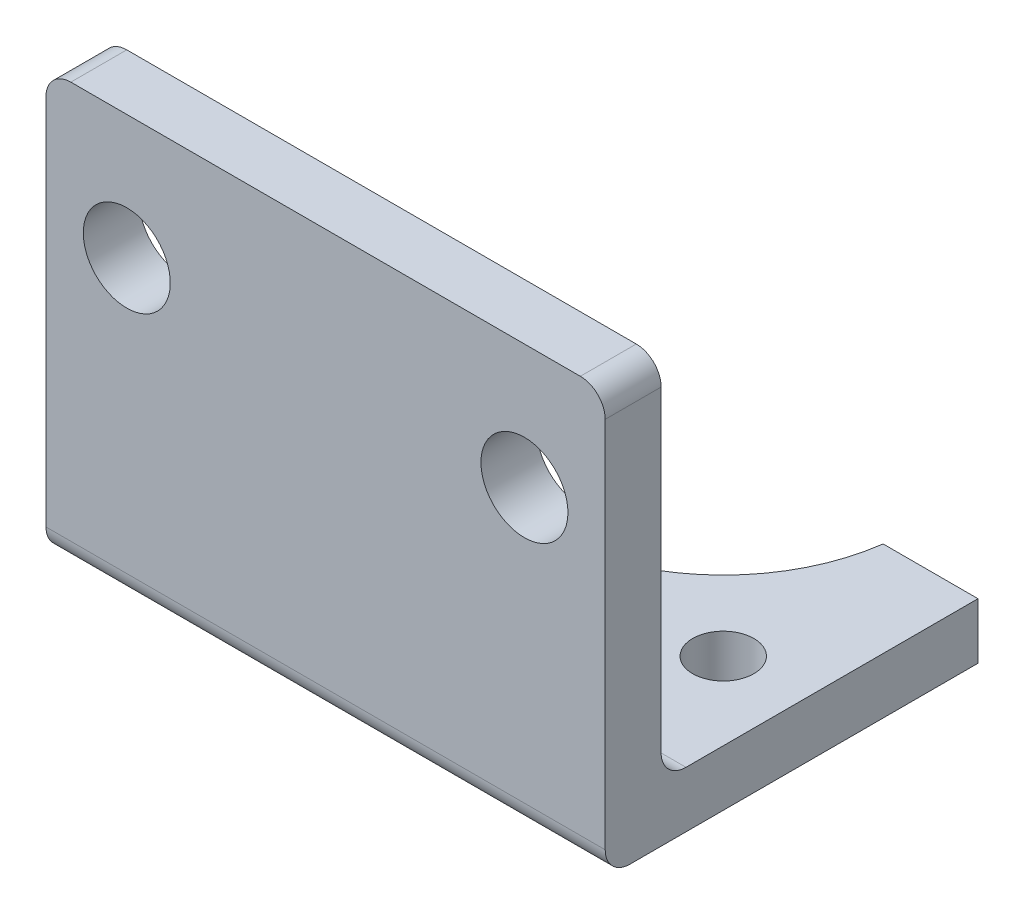
ISO-10303-21;
HEADER;
FILE_DESCRIPTION(('STEP AP214'),'2;1');
FILE_NAME('part.step','',(''),(''),'','','');
FILE_SCHEMA(('AUTOMOTIVE_DESIGN { 1 0 10303 214 1 1 1 1 }'));
ENDSEC;
DATA;
#1=APPLICATION_CONTEXT('core data for automotive mechanical design processes');
#2=APPLICATION_PROTOCOL_DEFINITION('international standard','automotive_design',2000,#1);
#3=PRODUCT_CONTEXT('',#1,'mechanical');
#4=PRODUCT('Part','Part','',(#3));
#5=PRODUCT_RELATED_PRODUCT_CATEGORY('part','',(#4));
#6=PRODUCT_DEFINITION_FORMATION('','',#4);
#7=PRODUCT_DEFINITION_CONTEXT('part definition',#1,'design');
#8=PRODUCT_DEFINITION('design','',#6,#7);
#9=PRODUCT_DEFINITION_SHAPE('','',#8);
#10=(LENGTH_UNIT() NAMED_UNIT(*) SI_UNIT(.MILLI.,.METRE.));
#11=(NAMED_UNIT(*) PLANE_ANGLE_UNIT() SI_UNIT($,.RADIAN.));
#12=(NAMED_UNIT(*) SI_UNIT($,.STERADIAN.) SOLID_ANGLE_UNIT());
#13=UNCERTAINTY_MEASURE_WITH_UNIT(LENGTH_MEASURE(1.E-05),#10,'distance_accuracy_value','');
#14=(GEOMETRIC_REPRESENTATION_CONTEXT(3) GLOBAL_UNCERTAINTY_ASSIGNED_CONTEXT((#13)) GLOBAL_UNIT_ASSIGNED_CONTEXT((#10,
#11,#12)) REPRESENTATION_CONTEXT('',''));
#15=CARTESIAN_POINT('',(0.,0.,0.));
#16=DIRECTION('',(0.,0.,1.));
#17=DIRECTION('',(1.,0.,0.));
#18=AXIS2_PLACEMENT_3D('',#15,#16,#17);
#19=CARTESIAN_POINT('',(0.,4.5,-32.));
#20=DIRECTION('',(0.,1.,0.));
#21=DIRECTION('',(0.,0.,1.));
#22=AXIS2_PLACEMENT_3D('',#19,#20,#21);
#23=PLANE('',#22);
#24=DIRECTION('',(0.,0.,1.));
#25=VECTOR('',#24,1.);
#26=CARTESIAN_POINT('',(-22.5,4.5,0.));
#27=LINE('',#26,#25);
#28=CARTESIAN_POINT('',(-22.5,4.5,-30.));
#29=VERTEX_POINT('',#28);
#30=CARTESIAN_POINT('',(-22.5,4.5,-6.5));
#31=VERTEX_POINT('',#30);
#32=EDGE_CURVE('E133',#29,#31,#27,.T.);
#33=ORIENTED_EDGE('',*,*,#32,.T.);
#34=DIRECTION('',(-1.,0.,0.));
#35=VECTOR('',#34,1.);
#36=CARTESIAN_POINT('',(22.5,4.5,-6.5));
#37=LINE('',#36,#35);
#38=CARTESIAN_POINT('',(22.5,4.5,-6.5));
#39=VERTEX_POINT('',#38);
#40=EDGE_CURVE('E130',#31,#39,#37,.F.);
#41=ORIENTED_EDGE('',*,*,#40,.T.);
#42=DIRECTION('',(0.,0.,-1.));
#43=VECTOR('',#42,1.);
#44=CARTESIAN_POINT('',(22.5,4.5,0.));
#45=LINE('',#44,#43);
#46=CARTESIAN_POINT('',(22.5,4.5,-30.));
#47=VERTEX_POINT('',#46);
#48=EDGE_CURVE('E122',#39,#47,#45,.T.);
#49=ORIENTED_EDGE('',*,*,#48,.T.);
#50=DIRECTION('',(-1.,0.,0.));
#51=VECTOR('',#50,1.);
#52=CARTESIAN_POINT('',(22.5,4.5,-30.));
#53=LINE('',#52,#51);
#54=CARTESIAN_POINT('',(14.8660687473185,4.5,-30.));
#55=VERTEX_POINT('',#54);
#56=EDGE_CURVE('E127',#47,#55,#53,.T.);
#57=ORIENTED_EDGE('',*,*,#56,.T.);
#58=CARTESIAN_POINT('',(0.,4.5,-32.));
#59=DIRECTION('',(0.,-1.,0.));
#60=DIRECTION('',(0.,0.,1.));
#61=AXIS2_PLACEMENT_3D('',#58,#59,#60);
#62=CIRCLE('',#61,15.);
#63=CARTESIAN_POINT('',(-14.8660687473185,4.5,-30.));
#64=VERTEX_POINT('',#63);
#65=EDGE_CURVE('E149',#55,#64,#62,.T.);
#66=ORIENTED_EDGE('',*,*,#65,.T.);
#67=DIRECTION('',(-1.,0.,0.));
#68=VECTOR('',#67,1.);
#69=CARTESIAN_POINT('',(-22.5,4.5,-30.));
#70=LINE('',#69,#68);
#71=EDGE_CURVE('E151',#64,#29,#70,.T.);
#72=ORIENTED_EDGE('',*,*,#71,.T.);
#73=EDGE_LOOP('',(#33,#41,#49,#57,#66,#72));
#74=FACE_BOUND('',#73,.T.);
#75=CARTESIAN_POINT('',(-16.25,4.5,-15.75));
#76=DIRECTION('',(0.,1.,0.));
#77=DIRECTION('',(0.,0.,1.));
#78=AXIS2_PLACEMENT_3D('',#75,#76,#77);
#79=CIRCLE('',#78,2.46);
#80=CARTESIAN_POINT('',(-16.25,4.5,-13.29));
#81=VERTEX_POINT('',#80);
#82=EDGE_CURVE('E160',#81,#81,#79,.T.);
#83=ORIENTED_EDGE('',*,*,#82,.F.);
#84=EDGE_LOOP('',(#83));
#85=FACE_BOUND('',#84,.T.);
#86=CARTESIAN_POINT('',(16.25,4.5,-15.75));
#87=DIRECTION('',(0.,1.,0.));
#88=DIRECTION('',(0.,0.,-1.));
#89=AXIS2_PLACEMENT_3D('',#86,#87,#88);
#90=CIRCLE('',#89,2.46);
#91=CARTESIAN_POINT('',(16.25,4.5,-18.21));
#92=VERTEX_POINT('',#91);
#93=EDGE_CURVE('E230',#92,#92,#90,.T.);
#94=ORIENTED_EDGE('',*,*,#93,.F.);
#95=EDGE_LOOP('',(#94));
#96=FACE_BOUND('',#95,.T.);
#97=ADVANCED_FACE('F32',(#74,#85,#96),#23,.T.);
#98=CARTESIAN_POINT('',(0.,0.,-32.));
#99=DIRECTION('',(0.,1.,0.));
#100=DIRECTION('',(0.,0.,1.));
#101=AXIS2_PLACEMENT_3D('',#98,#99,#100);
#102=PLANE('',#101);
#103=DIRECTION('',(0.,0.,-1.));
#104=VECTOR('',#103,1.);
#105=CARTESIAN_POINT('',(22.5,0.,0.));
#106=LINE('',#105,#104);
#107=CARTESIAN_POINT('',(22.5,0.,-2.));
#108=VERTEX_POINT('',#107);
#109=CARTESIAN_POINT('',(22.5,0.,-30.));
#110=VERTEX_POINT('',#109);
#111=EDGE_CURVE('E140',#108,#110,#106,.T.);
#112=ORIENTED_EDGE('',*,*,#111,.F.);
#113=DIRECTION('',(1.,0.,0.));
#114=VECTOR('',#113,1.);
#115=CARTESIAN_POINT('',(0.,0.,-2.));
#116=LINE('',#115,#114);
#117=CARTESIAN_POINT('',(-22.5,0.,-1.99999999999999));
#118=VERTEX_POINT('',#117);
#119=EDGE_CURVE('E182',#108,#118,#116,.F.);
#120=ORIENTED_EDGE('',*,*,#119,.T.);
#121=DIRECTION('',(0.,0.,1.));
#122=VECTOR('',#121,1.);
#123=CARTESIAN_POINT('',(-22.5,0.,0.));
#124=LINE('',#123,#122);
#125=CARTESIAN_POINT('',(-22.5,0.,-30.));
#126=VERTEX_POINT('',#125);
#127=EDGE_CURVE('E157',#126,#118,#124,.T.);
#128=ORIENTED_EDGE('',*,*,#127,.F.);
#129=DIRECTION('',(-1.,0.,0.));
#130=VECTOR('',#129,1.);
#131=CARTESIAN_POINT('',(-22.5,0.,-30.));
#132=LINE('',#131,#130);
#133=CARTESIAN_POINT('',(-14.8660687473185,0.,-30.));
#134=VERTEX_POINT('',#133);
#135=EDGE_CURVE('E166',#134,#126,#132,.T.);
#136=ORIENTED_EDGE('',*,*,#135,.F.);
#137=CARTESIAN_POINT('',(0.,0.,-32.));
#138=DIRECTION('',(0.,-1.,0.));
#139=DIRECTION('',(0.,0.,1.));
#140=AXIS2_PLACEMENT_3D('',#137,#138,#139);
#141=CIRCLE('',#140,15.);
#142=CARTESIAN_POINT('',(14.8660687473185,0.,-30.));
#143=VERTEX_POINT('',#142);
#144=EDGE_CURVE('E164',#143,#134,#141,.T.);
#145=ORIENTED_EDGE('',*,*,#144,.F.);
#146=DIRECTION('',(-1.,0.,0.));
#147=VECTOR('',#146,1.);
#148=CARTESIAN_POINT('',(22.5,0.,-30.));
#149=LINE('',#148,#147);
#150=EDGE_CURVE('E162',#110,#143,#149,.T.);
#151=ORIENTED_EDGE('',*,*,#150,.F.);
#152=EDGE_LOOP('',(#112,#120,#128,#136,#145,#151));
#153=FACE_BOUND('',#152,.T.);
#154=CARTESIAN_POINT('',(-16.25,0.,-15.75));
#155=DIRECTION('',(0.,1.,0.));
#156=DIRECTION('',(0.,0.,1.));
#157=AXIS2_PLACEMENT_3D('',#154,#155,#156);
#158=CIRCLE('',#157,2.46);
#159=CARTESIAN_POINT('',(-16.25,0.,-13.29));
#160=VERTEX_POINT('',#159);
#161=EDGE_CURVE('E236',#160,#160,#158,.T.);
#162=ORIENTED_EDGE('',*,*,#161,.T.);
#163=EDGE_LOOP('',(#162));
#164=FACE_BOUND('',#163,.T.);
#165=CARTESIAN_POINT('',(16.25,0.,-15.75));
#166=DIRECTION('',(0.,1.,0.));
#167=DIRECTION('',(0.,0.,-1.));
#168=AXIS2_PLACEMENT_3D('',#165,#166,#167);
#169=CIRCLE('',#168,2.46);
#170=CARTESIAN_POINT('',(16.25,0.,-18.21));
#171=VERTEX_POINT('',#170);
#172=EDGE_CURVE('E227',#171,#171,#169,.T.);
#173=ORIENTED_EDGE('',*,*,#172,.T.);
#174=EDGE_LOOP('',(#173));
#175=FACE_BOUND('',#174,.T.);
#176=ADVANCED_FACE('F249',(#153,#164,#175),#102,.F.);
#177=CARTESIAN_POINT('',(-22.5,4.5,0.));
#178=DIRECTION('',(1.,0.,0.));
#179=DIRECTION('',(0.,0.,-1.));
#180=AXIS2_PLACEMENT_3D('',#177,#178,#179);
#181=PLANE('',#180);
#182=DIRECTION('',(0.,-1.,0.));
#183=VECTOR('',#182,1.);
#184=CARTESIAN_POINT('',(-22.5,4.5,0.));
#185=LINE('',#184,#183);
#186=CARTESIAN_POINT('',(-22.5,32.,0.));
#187=VERTEX_POINT('',#186);
#188=CARTESIAN_POINT('',(-22.5,2.,0.));
#189=VERTEX_POINT('',#188);
#190=EDGE_CURVE('E175',#187,#189,#185,.T.);
#191=ORIENTED_EDGE('',*,*,#190,.F.);
#192=DIRECTION('',(0.,0.,1.));
#193=VECTOR('',#192,1.);
#194=CARTESIAN_POINT('',(-22.5,32.,-4.5));
#195=LINE('',#194,#193);
#196=CARTESIAN_POINT('',(-22.5,32.,-4.5));
#197=VERTEX_POINT('',#196);
#198=EDGE_CURVE('E11',#187,#197,#195,.F.);
#199=ORIENTED_EDGE('',*,*,#198,.T.);
#200=DIRECTION('',(0.,1.,0.));
#201=VECTOR('',#200,1.);
#202=CARTESIAN_POINT('',(-22.5,0.,-4.5));
#203=LINE('',#202,#201);
#204=CARTESIAN_POINT('',(-22.5,6.5,-4.5));
#205=VERTEX_POINT('',#204);
#206=EDGE_CURVE('E217',#205,#197,#203,.T.);
#207=ORIENTED_EDGE('',*,*,#206,.F.);
#208=CARTESIAN_POINT('',(-22.5,6.5,-6.5));
#209=DIRECTION('',(1.,0.,0.));
#210=DIRECTION('',(0.,0.,-1.));
#211=AXIS2_PLACEMENT_3D('',#208,#209,#210);
#212=CIRCLE('',#211,2.);
#213=EDGE_CURVE('E191',#205,#31,#212,.T.);
#214=ORIENTED_EDGE('',*,*,#213,.T.);
#215=ORIENTED_EDGE('',*,*,#32,.F.);
#216=DIRECTION('',(0.,-1.,0.));
#217=VECTOR('',#216,1.);
#218=CARTESIAN_POINT('',(-22.5,4.5,-30.));
#219=LINE('',#218,#217);
#220=EDGE_CURVE('E156',#29,#126,#219,.T.);
#221=ORIENTED_EDGE('',*,*,#220,.T.);
#222=ORIENTED_EDGE('',*,*,#127,.T.);
#223=CARTESIAN_POINT('',(-22.5,2.,-1.99999999999999));
#224=DIRECTION('',(1.,0.,0.));
#225=DIRECTION('',(0.,0.,-1.));
#226=AXIS2_PLACEMENT_3D('',#223,#224,#225);
#227=CIRCLE('',#226,2.);
#228=EDGE_CURVE('E184',#118,#189,#227,.F.);
#229=ORIENTED_EDGE('',*,*,#228,.T.);
#230=EDGE_LOOP('',(#191,#199,#207,#214,#215,#221,#222,#229));
#231=FACE_BOUND('',#230,.T.);
#232=ADVANCED_FACE('F247',(#231),#181,.F.);
#233=CARTESIAN_POINT('',(22.5,4.5,0.));
#234=DIRECTION('',(0.,0.,-1.));
#235=DIRECTION('',(-1.,0.,0.));
#236=AXIS2_PLACEMENT_3D('',#233,#234,#235);
#237=PLANE('',#236);
#238=CARTESIAN_POINT('',(16.,24.,0.));
#239=DIRECTION('',(0.,0.,-1.));
#240=DIRECTION('',(-1.,0.,0.));
#241=AXIS2_PLACEMENT_3D('',#238,#239,#240);
#242=CIRCLE('',#241,3.5);
#243=CARTESIAN_POINT('',(16.,27.5,0.));
#244=VERTEX_POINT('',#243);
#245=EDGE_CURVE('E218',#244,#244,#242,.T.);
#246=ORIENTED_EDGE('',*,*,#245,.T.);
#247=EDGE_LOOP('',(#246));
#248=FACE_BOUND('',#247,.T.);
#249=CARTESIAN_POINT('',(-16.,24.,0.));
#250=DIRECTION('',(0.,0.,-1.));
#251=DIRECTION('',(-1.,0.,0.));
#252=AXIS2_PLACEMENT_3D('',#249,#250,#251);
#253=CIRCLE('',#252,3.5);
#254=CARTESIAN_POINT('',(-16.,27.5,0.));
#255=VERTEX_POINT('',#254);
#256=EDGE_CURVE('E438',#255,#255,#253,.T.);
#257=ORIENTED_EDGE('',*,*,#256,.T.);
#258=EDGE_LOOP('',(#257));
#259=FACE_BOUND('',#258,.T.);
#260=DIRECTION('',(0.,-1.,0.));
#261=VECTOR('',#260,1.);
#262=CARTESIAN_POINT('',(22.5,4.5,0.));
#263=LINE('',#262,#261);
#264=CARTESIAN_POINT('',(22.5,32.,0.));
#265=VERTEX_POINT('',#264);
#266=CARTESIAN_POINT('',(22.5,2.,0.));
#267=VERTEX_POINT('',#266);
#268=EDGE_CURVE('E143',#265,#267,#263,.T.);
#269=ORIENTED_EDGE('',*,*,#268,.F.);
#270=CARTESIAN_POINT('',(20.5,32.,0.));
#271=DIRECTION('',(0.,0.,-1.));
#272=DIRECTION('',(-1.,0.,0.));
#273=AXIS2_PLACEMENT_3D('',#270,#271,#272);
#274=CIRCLE('',#273,2.);
#275=CARTESIAN_POINT('',(20.5,34.,0.));
#276=VERTEX_POINT('',#275);
#277=EDGE_CURVE('E200',#265,#276,#274,.F.);
#278=ORIENTED_EDGE('',*,*,#277,.T.);
#279=DIRECTION('',(1.,0.,0.));
#280=VECTOR('',#279,1.);
#281=CARTESIAN_POINT('',(-22.5,34.,0.));
#282=LINE('',#281,#280);
#283=CARTESIAN_POINT('',(-20.5,34.,0.));
#284=VERTEX_POINT('',#283);
#285=EDGE_CURVE('E224',#284,#276,#282,.T.);
#286=ORIENTED_EDGE('',*,*,#285,.F.);
#287=CARTESIAN_POINT('',(-20.5,32.,0.));
#288=DIRECTION('',(0.,0.,-1.));
#289=DIRECTION('',(-1.,0.,0.));
#290=AXIS2_PLACEMENT_3D('',#287,#288,#289);
#291=CIRCLE('',#290,2.);
#292=EDGE_CURVE('E198',#284,#187,#291,.F.);
#293=ORIENTED_EDGE('',*,*,#292,.T.);
#294=ORIENTED_EDGE('',*,*,#190,.T.);
#295=DIRECTION('',(1.,0.,0.));
#296=VECTOR('',#295,1.);
#297=CARTESIAN_POINT('',(22.5,2.,0.));
#298=LINE('',#297,#296);
#299=EDGE_CURVE('E177',#189,#267,#298,.T.);
#300=ORIENTED_EDGE('',*,*,#299,.T.);
#301=EDGE_LOOP('',(#269,#278,#286,#293,#294,#300));
#302=FACE_BOUND('',#301,.T.);
#303=ADVANCED_FACE('F223',(#248,#259,#302),#237,.F.);
#304=CARTESIAN_POINT('',(22.5,4.5,0.));
#305=DIRECTION('',(-1.,0.,0.));
#306=DIRECTION('',(0.,0.,1.));
#307=AXIS2_PLACEMENT_3D('',#304,#305,#306);
#308=PLANE('',#307);
#309=DIRECTION('',(0.,1.,0.));
#310=VECTOR('',#309,1.);
#311=CARTESIAN_POINT('',(22.5,0.,-4.5));
#312=LINE('',#311,#310);
#313=CARTESIAN_POINT('',(22.5,6.5,-4.5));
#314=VERTEX_POINT('',#313);
#315=CARTESIAN_POINT('',(22.5,32.,-4.5));
#316=VERTEX_POINT('',#315);
#317=EDGE_CURVE('E211',#314,#316,#312,.T.);
#318=ORIENTED_EDGE('',*,*,#317,.T.);
#319=DIRECTION('',(0.,0.,1.));
#320=VECTOR('',#319,1.);
#321=CARTESIAN_POINT('',(22.5,32.,0.));
#322=LINE('',#321,#320);
#323=EDGE_CURVE('E195',#316,#265,#322,.T.);
#324=ORIENTED_EDGE('',*,*,#323,.T.);
#325=ORIENTED_EDGE('',*,*,#268,.T.);
#326=CARTESIAN_POINT('',(22.5,2.,-2.));
#327=DIRECTION('',(-1.,0.,0.));
#328=DIRECTION('',(0.,0.,1.));
#329=AXIS2_PLACEMENT_3D('',#326,#327,#328);
#330=CIRCLE('',#329,2.);
#331=EDGE_CURVE('E180',#267,#108,#330,.F.);
#332=ORIENTED_EDGE('',*,*,#331,.T.);
#333=ORIENTED_EDGE('',*,*,#111,.T.);
#334=DIRECTION('',(0.,-1.,0.));
#335=VECTOR('',#334,1.);
#336=CARTESIAN_POINT('',(22.5,4.5,-30.));
#337=LINE('',#336,#335);
#338=EDGE_CURVE('E136',#47,#110,#337,.T.);
#339=ORIENTED_EDGE('',*,*,#338,.F.);
#340=ORIENTED_EDGE('',*,*,#48,.F.);
#341=CARTESIAN_POINT('',(22.5,6.5,-6.5));
#342=DIRECTION('',(-1.,0.,0.));
#343=DIRECTION('',(0.,0.,1.));
#344=AXIS2_PLACEMENT_3D('',#341,#342,#343);
#345=CIRCLE('',#344,2.);
#346=EDGE_CURVE('E193',#39,#314,#345,.T.);
#347=ORIENTED_EDGE('',*,*,#346,.T.);
#348=EDGE_LOOP('',(#318,#324,#325,#332,#333,#339,#340,#347));
#349=FACE_BOUND('',#348,.T.);
#350=ADVANCED_FACE('F138',(#349),#308,.F.);
#351=CARTESIAN_POINT('',(22.5,4.5,-30.));
#352=DIRECTION('',(0.,0.,1.));
#353=DIRECTION('',(1.,0.,0.));
#354=AXIS2_PLACEMENT_3D('',#351,#352,#353);
#355=PLANE('',#354);
#356=ORIENTED_EDGE('',*,*,#150,.T.);
#357=DIRECTION('',(0.,-1.,0.));
#358=VECTOR('',#357,1.);
#359=CARTESIAN_POINT('',(14.8660687473185,4.5,-30.));
#360=LINE('',#359,#358);
#361=EDGE_CURVE('E144',#55,#143,#360,.T.);
#362=ORIENTED_EDGE('',*,*,#361,.F.);
#363=ORIENTED_EDGE('',*,*,#56,.F.);
#364=ORIENTED_EDGE('',*,*,#338,.T.);
#365=EDGE_LOOP('',(#356,#362,#363,#364));
#366=FACE_BOUND('',#365,.T.);
#367=ADVANCED_FACE('F146',(#366),#355,.F.);
#368=CARTESIAN_POINT('',(0.,4.5,-32.));
#369=DIRECTION('',(0.,-1.,0.));
#370=DIRECTION('',(0.,0.,-1.));
#371=AXIS2_PLACEMENT_3D('',#368,#369,#370);
#372=CYLINDRICAL_SURFACE('',#371,15.);
#373=ORIENTED_EDGE('',*,*,#144,.T.);
#374=DIRECTION('',(0.,-1.,0.));
#375=VECTOR('',#374,1.);
#376=CARTESIAN_POINT('',(-14.8660687473185,4.5,-30.));
#377=LINE('',#376,#375);
#378=EDGE_CURVE('E170',#64,#134,#377,.T.);
#379=ORIENTED_EDGE('',*,*,#378,.F.);
#380=ORIENTED_EDGE('',*,*,#65,.F.);
#381=ORIENTED_EDGE('',*,*,#361,.T.);
#382=EDGE_LOOP('',(#373,#379,#380,#381));
#383=FACE_BOUND('',#382,.T.);
#384=ADVANCED_FACE('F271',(#383),#372,.F.);
#385=CARTESIAN_POINT('',(-22.5,4.5,-30.));
#386=DIRECTION('',(0.,0.,1.));
#387=DIRECTION('',(1.,0.,0.));
#388=AXIS2_PLACEMENT_3D('',#385,#386,#387);
#389=PLANE('',#388);
#390=ORIENTED_EDGE('',*,*,#135,.T.);
#391=ORIENTED_EDGE('',*,*,#220,.F.);
#392=ORIENTED_EDGE('',*,*,#71,.F.);
#393=ORIENTED_EDGE('',*,*,#378,.T.);
#394=EDGE_LOOP('',(#390,#391,#392,#393));
#395=FACE_BOUND('',#394,.T.);
#396=ADVANCED_FACE('F268',(#395),#389,.F.);
#397=CARTESIAN_POINT('',(-16.25,4.5,-15.75));
#398=DIRECTION('',(0.,-1.,0.));
#399=DIRECTION('',(0.,0.,-1.));
#400=AXIS2_PLACEMENT_3D('',#397,#398,#399);
#401=CYLINDRICAL_SURFACE('',#400,2.46);
#402=ORIENTED_EDGE('',*,*,#82,.T.);
#403=EDGE_LOOP('',(#402));
#404=FACE_BOUND('',#403,.T.);
#405=ORIENTED_EDGE('',*,*,#161,.F.);
#406=EDGE_LOOP('',(#405));
#407=FACE_BOUND('',#406,.T.);
#408=ADVANCED_FACE('F265',(#404,#407),#401,.F.);
#409=CARTESIAN_POINT('',(16.25,4.5,-15.75));
#410=DIRECTION('',(0.,-1.,0.));
#411=DIRECTION('',(0.,0.,-1.));
#412=AXIS2_PLACEMENT_3D('',#409,#410,#411);
#413=CYLINDRICAL_SURFACE('',#412,2.46);
#414=ORIENTED_EDGE('',*,*,#93,.T.);
#415=EDGE_LOOP('',(#414));
#416=FACE_BOUND('',#415,.T.);
#417=ORIENTED_EDGE('',*,*,#172,.F.);
#418=EDGE_LOOP('',(#417));
#419=FACE_BOUND('',#418,.T.);
#420=ADVANCED_FACE('F302',(#416,#419),#413,.F.);
#421=CARTESIAN_POINT('',(-22.5,34.,-4.5));
#422=DIRECTION('',(0.,1.,0.));
#423=DIRECTION('',(0.,0.,1.));
#424=AXIS2_PLACEMENT_3D('',#421,#422,#423);
#425=PLANE('',#424);
#426=ORIENTED_EDGE('',*,*,#285,.T.);
#427=DIRECTION('',(0.,0.,1.));
#428=VECTOR('',#427,1.);
#429=CARTESIAN_POINT('',(20.5,34.,-4.5));
#430=LINE('',#429,#428);
#431=CARTESIAN_POINT('',(20.5,34.,-4.5));
#432=VERTEX_POINT('',#431);
#433=EDGE_CURVE('E53',#276,#432,#430,.F.);
#434=ORIENTED_EDGE('',*,*,#433,.T.);
#435=DIRECTION('',(1.,0.,0.));
#436=VECTOR('',#435,1.);
#437=CARTESIAN_POINT('',(-22.5,34.,-4.5));
#438=LINE('',#437,#436);
#439=CARTESIAN_POINT('',(-20.5,34.,-4.5));
#440=VERTEX_POINT('',#439);
#441=EDGE_CURVE('E213',#440,#432,#438,.T.);
#442=ORIENTED_EDGE('',*,*,#441,.F.);
#443=DIRECTION('',(0.,0.,1.));
#444=VECTOR('',#443,1.);
#445=CARTESIAN_POINT('',(-20.5,34.,0.));
#446=LINE('',#445,#444);
#447=EDGE_CURVE('E202',#440,#284,#446,.T.);
#448=ORIENTED_EDGE('',*,*,#447,.T.);
#449=EDGE_LOOP('',(#426,#434,#442,#448));
#450=FACE_BOUND('',#449,.T.);
#451=ADVANCED_FACE('F225',(#450),#425,.T.);
#452=CARTESIAN_POINT('',(-22.5,0.,-4.5));
#453=DIRECTION('',(0.,0.,-1.));
#454=DIRECTION('',(0.,1.,0.));
#455=AXIS2_PLACEMENT_3D('',#452,#453,#454);
#456=PLANE('',#455);
#457=CARTESIAN_POINT('',(16.,24.,-4.5));
#458=DIRECTION('',(0.,0.,-1.));
#459=DIRECTION('',(0.,1.,0.));
#460=AXIS2_PLACEMENT_3D('',#457,#458,#459);
#461=CIRCLE('',#460,3.5);
#462=CARTESIAN_POINT('',(16.,27.5,-4.5));
#463=VERTEX_POINT('',#462);
#464=EDGE_CURVE('E435',#463,#463,#461,.T.);
#465=ORIENTED_EDGE('',*,*,#464,.F.);
#466=EDGE_LOOP('',(#465));
#467=FACE_BOUND('',#466,.T.);
#468=CARTESIAN_POINT('',(-16.,24.,-4.5));
#469=DIRECTION('',(0.,0.,-1.));
#470=DIRECTION('',(0.,1.,0.));
#471=AXIS2_PLACEMENT_3D('',#468,#469,#470);
#472=CIRCLE('',#471,3.5);
#473=CARTESIAN_POINT('',(-16.,27.5,-4.5));
#474=VERTEX_POINT('',#473);
#475=EDGE_CURVE('E443',#474,#474,#472,.T.);
#476=ORIENTED_EDGE('',*,*,#475,.F.);
#477=EDGE_LOOP('',(#476));
#478=FACE_BOUND('',#477,.T.);
#479=ORIENTED_EDGE('',*,*,#441,.T.);
#480=CARTESIAN_POINT('',(20.5,32.,-4.5));
#481=DIRECTION('',(0.,0.,-1.));
#482=DIRECTION('',(0.,1.,0.));
#483=AXIS2_PLACEMENT_3D('',#480,#481,#482);
#484=CIRCLE('',#483,2.);
#485=EDGE_CURVE('E40',#432,#316,#484,.T.);
#486=ORIENTED_EDGE('',*,*,#485,.T.);
#487=ORIENTED_EDGE('',*,*,#317,.F.);
#488=DIRECTION('',(-1.,0.,0.));
#489=VECTOR('',#488,1.);
#490=CARTESIAN_POINT('',(-22.5,6.5,-4.5));
#491=LINE('',#490,#489);
#492=EDGE_CURVE('E187',#314,#205,#491,.T.);
#493=ORIENTED_EDGE('',*,*,#492,.T.);
#494=ORIENTED_EDGE('',*,*,#206,.T.);
#495=CARTESIAN_POINT('',(-20.5,32.,-4.5));
#496=DIRECTION('',(0.,0.,-1.));
#497=DIRECTION('',(0.,1.,0.));
#498=AXIS2_PLACEMENT_3D('',#495,#496,#497);
#499=CIRCLE('',#498,2.);
#500=EDGE_CURVE('E206',#197,#440,#499,.T.);
#501=ORIENTED_EDGE('',*,*,#500,.T.);
#502=EDGE_LOOP('',(#479,#486,#487,#493,#494,#501));
#503=FACE_BOUND('',#502,.T.);
#504=ADVANCED_FACE('F210',(#467,#478,#503),#456,.T.);
#505=CARTESIAN_POINT('',(-16.,24.,18.));
#506=DIRECTION('',(0.,0.,-1.));
#507=DIRECTION('',(0.,1.,0.));
#508=AXIS2_PLACEMENT_3D('',#505,#506,#507);
#509=CYLINDRICAL_SURFACE('',#508,3.5);
#510=CARTESIAN_POINT('',(-16.,27.5,-4.5));
#511=CARTESIAN_POINT('',(-16.,27.5,-4.453125));
#512=CARTESIAN_POINT('',(-16.,27.5,-4.40625));
#513=CARTESIAN_POINT('',(-16.,27.5,-4.3125));
#514=CARTESIAN_POINT('',(-16.,27.5,-4.265625));
#515=CARTESIAN_POINT('',(-16.,27.5,-4.171875));
#516=CARTESIAN_POINT('',(-16.,27.5,-4.125));
#517=CARTESIAN_POINT('',(-16.,27.5,-4.03125));
#518=CARTESIAN_POINT('',(-16.,27.5,-3.984375));
#519=CARTESIAN_POINT('',(-16.,27.5,-3.890625));
#520=CARTESIAN_POINT('',(-16.,27.5,-3.84375));
#521=CARTESIAN_POINT('',(-16.,27.5,-3.75));
#522=CARTESIAN_POINT('',(-16.,27.5,-3.703125));
#523=CARTESIAN_POINT('',(-16.,27.5,-3.609375));
#524=CARTESIAN_POINT('',(-16.,27.5,-3.5625));
#525=CARTESIAN_POINT('',(-16.,27.5,-3.46875));
#526=CARTESIAN_POINT('',(-16.,27.5,-3.421875));
#527=CARTESIAN_POINT('',(-16.,27.5,-3.328125));
#528=CARTESIAN_POINT('',(-16.,27.5,-3.28125));
#529=CARTESIAN_POINT('',(-16.,27.5,-3.1875));
#530=CARTESIAN_POINT('',(-16.,27.5,-3.140625));
#531=CARTESIAN_POINT('',(-16.,27.5,-3.046875));
#532=CARTESIAN_POINT('',(-16.,27.5,-3.));
#533=CARTESIAN_POINT('',(-16.,27.5,-2.90625));
#534=CARTESIAN_POINT('',(-16.,27.5,-2.859375));
#535=CARTESIAN_POINT('',(-16.,27.5,-2.765625));
#536=CARTESIAN_POINT('',(-16.,27.5,-2.71875));
#537=CARTESIAN_POINT('',(-16.,27.5,-2.625));
#538=CARTESIAN_POINT('',(-16.,27.5,-2.578125));
#539=CARTESIAN_POINT('',(-16.,27.5,-2.484375));
#540=CARTESIAN_POINT('',(-16.,27.5,-2.4375));
#541=CARTESIAN_POINT('',(-16.,27.5,-2.34375));
#542=CARTESIAN_POINT('',(-16.,27.5,-2.296875));
#543=CARTESIAN_POINT('',(-16.,27.5,-2.203125));
#544=CARTESIAN_POINT('',(-16.,27.5,-2.15625));
#545=CARTESIAN_POINT('',(-16.,27.5,-2.0625));
#546=CARTESIAN_POINT('',(-16.,27.5,-2.015625));
#547=CARTESIAN_POINT('',(-16.,27.5,-1.921875));
#548=CARTESIAN_POINT('',(-16.,27.5,-1.875));
#549=CARTESIAN_POINT('',(-16.,27.5,-1.78125));
#550=CARTESIAN_POINT('',(-16.,27.5,-1.734375));
#551=CARTESIAN_POINT('',(-16.,27.5,-1.640625));
#552=CARTESIAN_POINT('',(-16.,27.5,-1.59375));
#553=CARTESIAN_POINT('',(-16.,27.5,-1.5));
#554=CARTESIAN_POINT('',(-16.,27.5,-1.453125));
#555=CARTESIAN_POINT('',(-16.,27.5,-1.359375));
#556=CARTESIAN_POINT('',(-16.,27.5,-1.3125));
#557=CARTESIAN_POINT('',(-16.,27.5,-1.21875));
#558=CARTESIAN_POINT('',(-16.,27.5,-1.171875));
#559=CARTESIAN_POINT('',(-16.,27.5,-1.078125));
#560=CARTESIAN_POINT('',(-16.,27.5,-1.03125));
#561=CARTESIAN_POINT('',(-16.,27.5,-0.937499999999999));
#562=CARTESIAN_POINT('',(-16.,27.5,-0.890624999999998));
#563=CARTESIAN_POINT('',(-16.,27.5,-0.796874999999997));
#564=CARTESIAN_POINT('',(-16.,27.5,-0.749999999999996));
#565=CARTESIAN_POINT('',(-16.,27.5,-0.656249999999996));
#566=CARTESIAN_POINT('',(-16.,27.5,-0.609374999999997));
#567=CARTESIAN_POINT('',(-16.,27.5,-0.515624999999998));
#568=CARTESIAN_POINT('',(-16.,27.5,-0.468749999999998));
#569=CARTESIAN_POINT('',(-16.,27.5,-0.374999999999998));
#570=CARTESIAN_POINT('',(-16.,27.5,-0.328124999999997));
#571=CARTESIAN_POINT('',(-16.,27.5,-0.234374999999996));
#572=CARTESIAN_POINT('',(-16.,27.5,-0.187499999999996));
#573=CARTESIAN_POINT('',(-16.,27.5,-0.0937499999999954));
#574=CARTESIAN_POINT('',(-16.,27.5,-0.046874999999996));
#575=CARTESIAN_POINT('',(-16.,27.5,0.));
#576=B_SPLINE_CURVE_WITH_KNOTS('',3,(#510,#511,#512,#513,#514,#515,#516,#517,#518,#519,#520,
#521,#522,#523,#524,#525,#526,#527,#528,#529,#530,#531,#532,#533,#534,#535,#536,#537,#538,#539,
#540,#541,#542,#543,#544,#545,#546,#547,#548,#549,#550,#551,#552,#553,#554,#555,#556,#557,#558,
#559,#560,#561,#562,#563,#564,#565,#566,#567,#568,#569,#570,#571,#572,#573,#574,#575),
.UNSPECIFIED.,.F.,.F.,(4,2,2,2,2,2,2,2,2,2,2,2,2,2,2,2,2,2,2,2,2,2,2,2,2,2,2,2,2,2,2,2,4),(0.,
0.140624999999998,0.28125,0.421875000000002,0.5625,0.703124999999999,0.843750000000001,
0.984375000000003,1.125,1.265625,1.40625,1.546875,1.6875,1.828125,1.96875,2.109375,2.25,
2.390625,2.53125,2.671875,2.8125,2.953125,3.09375,3.234375,3.375,3.515625,3.65625,
3.79687500000001,3.9375,4.078125,4.21875,4.35937500000001,4.5),.UNSPECIFIED.);
#577=EDGE_CURVE('BSEAM321',#474,#255,#576,.T.);
#578=ORIENTED_EDGE('',*,*,#475,.T.);
#579=ORIENTED_EDGE('',*,*,#256,.F.);
#580=ORIENTED_EDGE('',*,*,#577,.T.);
#581=ORIENTED_EDGE('',*,*,#577,.F.);
#582=EDGE_LOOP('',(#578,#580,#579,#581));
#583=FACE_BOUND('',#582,.T.);
#584=ADVANCED_FACE('F321',(#583),#509,.F.);
#585=CARTESIAN_POINT('',(16.,24.,18.));
#586=DIRECTION('',(0.,0.,-1.));
#587=DIRECTION('',(0.,1.,0.));
#588=AXIS2_PLACEMENT_3D('',#585,#586,#587);
#589=CYLINDRICAL_SURFACE('',#588,3.5);
#590=CARTESIAN_POINT('',(16.,27.5,-4.5));
#591=CARTESIAN_POINT('',(16.,27.5,-4.453125));
#592=CARTESIAN_POINT('',(16.,27.5,-4.40625));
#593=CARTESIAN_POINT('',(16.,27.5,-4.3125));
#594=CARTESIAN_POINT('',(16.,27.5,-4.265625));
#595=CARTESIAN_POINT('',(16.,27.5,-4.171875));
#596=CARTESIAN_POINT('',(16.,27.5,-4.125));
#597=CARTESIAN_POINT('',(16.,27.5,-4.03125));
#598=CARTESIAN_POINT('',(16.,27.5,-3.984375));
#599=CARTESIAN_POINT('',(16.,27.5,-3.890625));
#600=CARTESIAN_POINT('',(16.,27.5,-3.84375));
#601=CARTESIAN_POINT('',(16.,27.5,-3.75));
#602=CARTESIAN_POINT('',(16.,27.5,-3.703125));
#603=CARTESIAN_POINT('',(16.,27.5,-3.609375));
#604=CARTESIAN_POINT('',(16.,27.5,-3.5625));
#605=CARTESIAN_POINT('',(16.,27.5,-3.46875));
#606=CARTESIAN_POINT('',(16.,27.5,-3.421875));
#607=CARTESIAN_POINT('',(16.,27.5,-3.328125));
#608=CARTESIAN_POINT('',(16.,27.5,-3.28125));
#609=CARTESIAN_POINT('',(16.,27.5,-3.1875));
#610=CARTESIAN_POINT('',(16.,27.5,-3.140625));
#611=CARTESIAN_POINT('',(16.,27.5,-3.046875));
#612=CARTESIAN_POINT('',(16.,27.5,-3.));
#613=CARTESIAN_POINT('',(16.,27.5,-2.90625));
#614=CARTESIAN_POINT('',(16.,27.5,-2.859375));
#615=CARTESIAN_POINT('',(16.,27.5,-2.765625));
#616=CARTESIAN_POINT('',(16.,27.5,-2.71875));
#617=CARTESIAN_POINT('',(16.,27.5,-2.625));
#618=CARTESIAN_POINT('',(16.,27.5,-2.578125));
#619=CARTESIAN_POINT('',(16.,27.5,-2.484375));
#620=CARTESIAN_POINT('',(16.,27.5,-2.4375));
#621=CARTESIAN_POINT('',(16.,27.5,-2.34375));
#622=CARTESIAN_POINT('',(16.,27.5,-2.296875));
#623=CARTESIAN_POINT('',(16.,27.5,-2.203125));
#624=CARTESIAN_POINT('',(16.,27.5,-2.15625));
#625=CARTESIAN_POINT('',(16.,27.5,-2.0625));
#626=CARTESIAN_POINT('',(16.,27.5,-2.015625));
#627=CARTESIAN_POINT('',(16.,27.5,-1.921875));
#628=CARTESIAN_POINT('',(16.,27.5,-1.875));
#629=CARTESIAN_POINT('',(16.,27.5,-1.78125));
#630=CARTESIAN_POINT('',(16.,27.5,-1.734375));
#631=CARTESIAN_POINT('',(16.,27.5,-1.640625));
#632=CARTESIAN_POINT('',(16.,27.5,-1.59375));
#633=CARTESIAN_POINT('',(16.,27.5,-1.5));
#634=CARTESIAN_POINT('',(16.,27.5,-1.453125));
#635=CARTESIAN_POINT('',(16.,27.5,-1.359375));
#636=CARTESIAN_POINT('',(16.,27.5,-1.3125));
#637=CARTESIAN_POINT('',(16.,27.5,-1.21875));
#638=CARTESIAN_POINT('',(16.,27.5,-1.171875));
#639=CARTESIAN_POINT('',(16.,27.5,-1.078125));
#640=CARTESIAN_POINT('',(16.,27.5,-1.03125));
#641=CARTESIAN_POINT('',(16.,27.5,-0.937499999999999));
#642=CARTESIAN_POINT('',(16.,27.5,-0.890624999999998));
#643=CARTESIAN_POINT('',(16.,27.5,-0.796874999999997));
#644=CARTESIAN_POINT('',(16.,27.5,-0.749999999999996));
#645=CARTESIAN_POINT('',(16.,27.5,-0.656249999999996));
#646=CARTESIAN_POINT('',(16.,27.5,-0.609374999999997));
#647=CARTESIAN_POINT('',(16.,27.5,-0.515624999999998));
#648=CARTESIAN_POINT('',(16.,27.5,-0.468749999999998));
#649=CARTESIAN_POINT('',(16.,27.5,-0.374999999999998));
#650=CARTESIAN_POINT('',(16.,27.5,-0.328124999999997));
#651=CARTESIAN_POINT('',(16.,27.5,-0.234374999999996));
#652=CARTESIAN_POINT('',(16.,27.5,-0.187499999999996));
#653=CARTESIAN_POINT('',(16.,27.5,-0.0937499999999954));
#654=CARTESIAN_POINT('',(16.,27.5,-0.046874999999996));
#655=CARTESIAN_POINT('',(16.,27.5,0.));
#656=B_SPLINE_CURVE_WITH_KNOTS('',3,(#590,#591,#592,#593,#594,#595,#596,#597,#598,#599,#600,
#601,#602,#603,#604,#605,#606,#607,#608,#609,#610,#611,#612,#613,#614,#615,#616,#617,#618,#619,
#620,#621,#622,#623,#624,#625,#626,#627,#628,#629,#630,#631,#632,#633,#634,#635,#636,#637,#638,
#639,#640,#641,#642,#643,#644,#645,#646,#647,#648,#649,#650,#651,#652,#653,#654,#655),
.UNSPECIFIED.,.F.,.F.,(4,2,2,2,2,2,2,2,2,2,2,2,2,2,2,2,2,2,2,2,2,2,2,2,2,2,2,2,2,2,2,2,4),(0.,
0.140624999999998,0.28125,0.421875000000002,0.5625,0.703124999999999,0.843750000000001,
0.984375000000003,1.125,1.265625,1.40625,1.546875,1.6875,1.828125,1.96875,2.109375,2.25,
2.390625,2.53125,2.671875,2.8125,2.953125,3.09375,3.234375,3.375,3.515625,3.65625,
3.79687500000001,3.9375,4.078125,4.21875,4.35937500000001,4.5),.UNSPECIFIED.);
#657=EDGE_CURVE('BSEAM329',#463,#244,#656,.T.);
#658=ORIENTED_EDGE('',*,*,#464,.T.);
#659=ORIENTED_EDGE('',*,*,#245,.F.);
#660=ORIENTED_EDGE('',*,*,#657,.T.);
#661=ORIENTED_EDGE('',*,*,#657,.F.);
#662=EDGE_LOOP('',(#658,#660,#659,#661));
#663=FACE_BOUND('',#662,.T.);
#664=ADVANCED_FACE('F329',(#663),#589,.F.);
#665=CARTESIAN_POINT('',(22.5,2.,-2.));
#666=DIRECTION('',(1.,0.,0.));
#667=DIRECTION('',(0.,0.,-1.));
#668=AXIS2_PLACEMENT_3D('',#665,#666,#667);
#669=CYLINDRICAL_SURFACE('',#668,2.);
#670=ORIENTED_EDGE('',*,*,#228,.F.);
#671=ORIENTED_EDGE('',*,*,#119,.F.);
#672=ORIENTED_EDGE('',*,*,#331,.F.);
#673=ORIENTED_EDGE('',*,*,#299,.F.);
#674=EDGE_LOOP('',(#670,#671,#672,#673));
#675=FACE_BOUND('',#674,.T.);
#676=ADVANCED_FACE('F337',(#675),#669,.T.);
#677=CARTESIAN_POINT('',(-22.5,6.5,-6.5));
#678=DIRECTION('',(1.,0.,0.));
#679=DIRECTION('',(0.,0.,-1.));
#680=AXIS2_PLACEMENT_3D('',#677,#678,#679);
#681=CYLINDRICAL_SURFACE('',#680,2.);
#682=ORIENTED_EDGE('',*,*,#346,.F.);
#683=ORIENTED_EDGE('',*,*,#40,.F.);
#684=ORIENTED_EDGE('',*,*,#213,.F.);
#685=ORIENTED_EDGE('',*,*,#492,.F.);
#686=EDGE_LOOP('',(#682,#683,#684,#685));
#687=FACE_BOUND('',#686,.T.);
#688=ADVANCED_FACE('F245',(#687),#681,.F.);
#689=CARTESIAN_POINT('',(20.5,32.,0.));
#690=DIRECTION('',(0.,0.,-1.));
#691=DIRECTION('',(-1.,0.,0.));
#692=AXIS2_PLACEMENT_3D('',#689,#690,#691);
#693=CYLINDRICAL_SURFACE('',#692,2.);
#694=ORIENTED_EDGE('',*,*,#485,.F.);
#695=ORIENTED_EDGE('',*,*,#433,.F.);
#696=ORIENTED_EDGE('',*,*,#277,.F.);
#697=ORIENTED_EDGE('',*,*,#323,.F.);
#698=EDGE_LOOP('',(#694,#695,#696,#697));
#699=FACE_BOUND('',#698,.T.);
#700=ADVANCED_FACE('F220',(#699),#693,.T.);
#701=CARTESIAN_POINT('',(-20.5,32.,-4.5));
#702=DIRECTION('',(0.,0.,-1.));
#703=DIRECTION('',(-1.,0.,0.));
#704=AXIS2_PLACEMENT_3D('',#701,#702,#703);
#705=CYLINDRICAL_SURFACE('',#704,2.);
#706=ORIENTED_EDGE('',*,*,#500,.F.);
#707=ORIENTED_EDGE('',*,*,#198,.F.);
#708=ORIENTED_EDGE('',*,*,#292,.F.);
#709=ORIENTED_EDGE('',*,*,#447,.F.);
#710=EDGE_LOOP('',(#706,#707,#708,#709));
#711=FACE_BOUND('',#710,.T.);
#712=ADVANCED_FACE('F34',(#711),#705,.T.);
#713=CLOSED_SHELL('',(#97,#176,#232,#303,#350,#367,#384,#396,#408,#420,#451,#504,#584,#664,#676,
#688,#700,#712));
#714=MANIFOLD_SOLID_BREP('B2',#713);
#715=ADVANCED_BREP_SHAPE_REPRESENTATION('',(#18,#714),#14);
#716=SHAPE_DEFINITION_REPRESENTATION(#9,#715);
ENDSEC;
END-ISO-10303-21;
